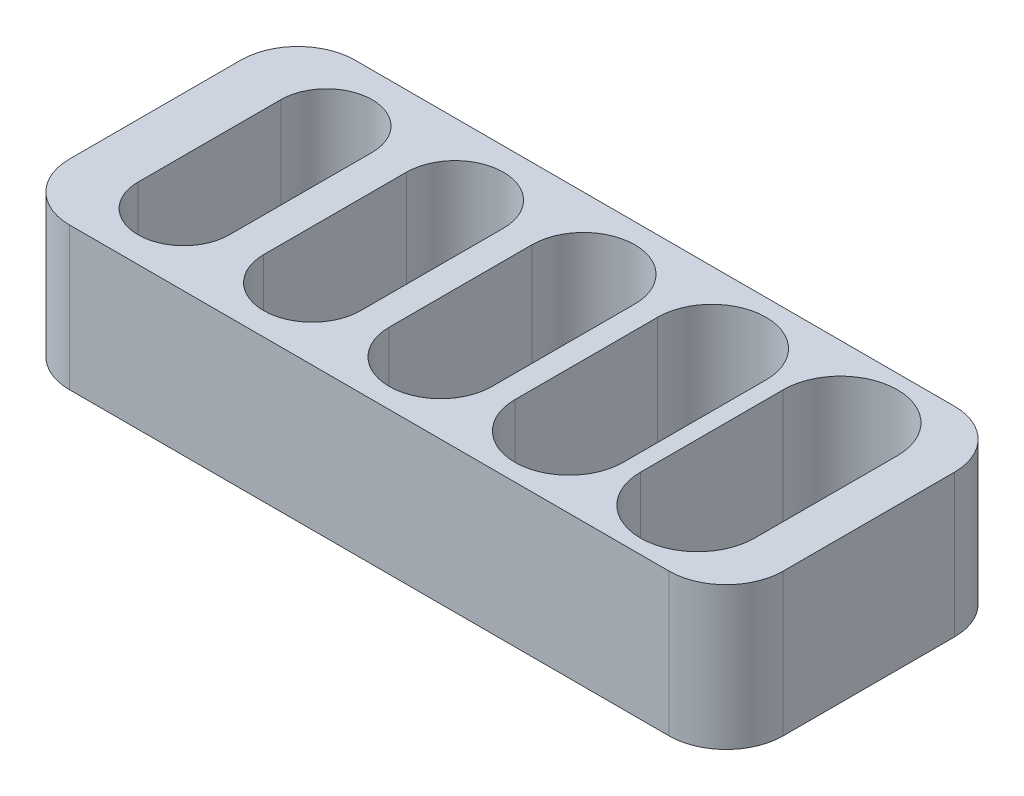
ISO-10303-21;
HEADER;
FILE_DESCRIPTION(('STEP AP214'),'2;1');
FILE_NAME('part.step','',(''),(''),'','','');
FILE_SCHEMA(('AUTOMOTIVE_DESIGN { 1 0 10303 214 1 1 1 1 }'));
ENDSEC;
DATA;
#1=APPLICATION_CONTEXT('core data for automotive mechanical design processes');
#2=APPLICATION_PROTOCOL_DEFINITION('international standard','automotive_design',2000,#1);
#3=PRODUCT_CONTEXT('',#1,'mechanical');
#4=PRODUCT('Part','Part','',(#3));
#5=PRODUCT_RELATED_PRODUCT_CATEGORY('part','',(#4));
#6=PRODUCT_DEFINITION_FORMATION('','',#4);
#7=PRODUCT_DEFINITION_CONTEXT('part definition',#1,'design');
#8=PRODUCT_DEFINITION('design','',#6,#7);
#9=PRODUCT_DEFINITION_SHAPE('','',#8);
#10=(LENGTH_UNIT() NAMED_UNIT(*) SI_UNIT(.MILLI.,.METRE.));
#11=(NAMED_UNIT(*) PLANE_ANGLE_UNIT() SI_UNIT($,.RADIAN.));
#12=(NAMED_UNIT(*) SI_UNIT($,.STERADIAN.) SOLID_ANGLE_UNIT());
#13=UNCERTAINTY_MEASURE_WITH_UNIT(LENGTH_MEASURE(1.E-05),#10,'distance_accuracy_value','');
#14=(GEOMETRIC_REPRESENTATION_CONTEXT(3) GLOBAL_UNCERTAINTY_ASSIGNED_CONTEXT((#13)) GLOBAL_UNIT_ASSIGNED_CONTEXT((#10,
#11,#12)) REPRESENTATION_CONTEXT('',''));
#15=CARTESIAN_POINT('',(0.,0.,0.));
#16=DIRECTION('',(0.,0.,1.));
#17=DIRECTION('',(1.,0.,0.));
#18=AXIS2_PLACEMENT_3D('',#15,#16,#17);
#19=CARTESIAN_POINT('',(0.,5.,0.));
#20=DIRECTION('',(0.,1.,0.));
#21=DIRECTION('',(0.,0.,1.));
#22=AXIS2_PLACEMENT_3D('',#19,#20,#21);
#23=PLANE('',#22);
#24=DIRECTION('',(0.,0.,-1.));
#25=VECTOR('',#24,1.);
#26=CARTESIAN_POINT('',(12.5,5.,5.));
#27=LINE('',#26,#25);
#28=CARTESIAN_POINT('',(12.5,5.,3.));
#29=VERTEX_POINT('',#28);
#30=CARTESIAN_POINT('',(12.5,5.,-3.));
#31=VERTEX_POINT('',#30);
#32=EDGE_CURVE('E465',#29,#31,#27,.T.);
#33=ORIENTED_EDGE('',*,*,#32,.T.);
#34=CARTESIAN_POINT('',(10.5,5.,-3.));
#35=DIRECTION('',(0.,1.,0.));
#36=DIRECTION('',(0.,0.,1.));
#37=AXIS2_PLACEMENT_3D('',#34,#35,#36);
#38=CIRCLE('',#37,2.);
#39=CARTESIAN_POINT('',(10.5,5.,-5.));
#40=VERTEX_POINT('',#39);
#41=EDGE_CURVE('E520',#31,#40,#38,.T.);
#42=ORIENTED_EDGE('',*,*,#41,.T.);
#43=DIRECTION('',(-1.,0.,0.));
#44=VECTOR('',#43,1.);
#45=CARTESIAN_POINT('',(12.5,5.,-5.));
#46=LINE('',#45,#44);
#47=CARTESIAN_POINT('',(-10.5,5.,-5.));
#48=VERTEX_POINT('',#47);
#49=EDGE_CURVE('E469',#40,#48,#46,.T.);
#50=ORIENTED_EDGE('',*,*,#49,.T.);
#51=CARTESIAN_POINT('',(-10.5,5.,-3.));
#52=DIRECTION('',(0.,1.,0.));
#53=DIRECTION('',(0.,0.,1.));
#54=AXIS2_PLACEMENT_3D('',#51,#52,#53);
#55=CIRCLE('',#54,2.);
#56=CARTESIAN_POINT('',(-12.5,5.,-3.));
#57=VERTEX_POINT('',#56);
#58=EDGE_CURVE('E512',#48,#57,#55,.T.);
#59=ORIENTED_EDGE('',*,*,#58,.T.);
#60=DIRECTION('',(0.,0.,1.));
#61=VECTOR('',#60,1.);
#62=CARTESIAN_POINT('',(-12.5,5.,5.));
#63=LINE('',#62,#61);
#64=CARTESIAN_POINT('',(-12.5,5.,3.));
#65=VERTEX_POINT('',#64);
#66=EDGE_CURVE('E458',#57,#65,#63,.T.);
#67=ORIENTED_EDGE('',*,*,#66,.T.);
#68=CARTESIAN_POINT('',(-10.5,5.,3.));
#69=DIRECTION('',(0.,1.,0.));
#70=DIRECTION('',(0.,0.,1.));
#71=AXIS2_PLACEMENT_3D('',#68,#69,#70);
#72=CIRCLE('',#71,2.);
#73=CARTESIAN_POINT('',(-10.5,5.,5.));
#74=VERTEX_POINT('',#73);
#75=EDGE_CURVE('E68',#65,#74,#72,.T.);
#76=ORIENTED_EDGE('',*,*,#75,.T.);
#77=DIRECTION('',(1.,0.,0.));
#78=VECTOR('',#77,1.);
#79=CARTESIAN_POINT('',(12.5,5.,5.));
#80=LINE('',#79,#78);
#81=CARTESIAN_POINT('',(10.5,5.,5.));
#82=VERTEX_POINT('',#81);
#83=EDGE_CURVE('E461',#74,#82,#80,.T.);
#84=ORIENTED_EDGE('',*,*,#83,.T.);
#85=CARTESIAN_POINT('',(10.5,5.,3.));
#86=DIRECTION('',(0.,1.,0.));
#87=DIRECTION('',(0.,0.,1.));
#88=AXIS2_PLACEMENT_3D('',#85,#86,#87);
#89=CIRCLE('',#88,2.);
#90=EDGE_CURVE('E517',#82,#29,#89,.T.);
#91=ORIENTED_EDGE('',*,*,#90,.T.);
#92=EDGE_LOOP('',(#33,#42,#50,#59,#67,#76,#84,#91));
#93=FACE_BOUND('',#92,.T.);
#94=DIRECTION('',(0.,0.,-1.));
#95=VECTOR('',#94,1.);
#96=CARTESIAN_POINT('',(1.8,5.,2.5));
#97=LINE('',#96,#95);
#98=CARTESIAN_POINT('',(1.8,5.,2.5));
#99=VERTEX_POINT('',#98);
#100=CARTESIAN_POINT('',(1.8,5.,-2.5));
#101=VERTEX_POINT('',#100);
#102=EDGE_CURVE('E418',#99,#101,#97,.T.);
#103=ORIENTED_EDGE('',*,*,#102,.F.);
#104=CARTESIAN_POINT('',(0.,5.,2.5));
#105=DIRECTION('',(0.,1.,0.));
#106=DIRECTION('',(0.,0.,1.));
#107=AXIS2_PLACEMENT_3D('',#104,#105,#106);
#108=CIRCLE('',#107,1.8);
#109=CARTESIAN_POINT('',(-1.8,5.,2.5));
#110=VERTEX_POINT('',#109);
#111=EDGE_CURVE('E415',#110,#99,#108,.T.);
#112=ORIENTED_EDGE('',*,*,#111,.F.);
#113=DIRECTION('',(0.,0.,1.));
#114=VECTOR('',#113,1.);
#115=CARTESIAN_POINT('',(-1.8,5.,2.5));
#116=LINE('',#115,#114);
#117=CARTESIAN_POINT('',(-1.8,5.,-2.5));
#118=VERTEX_POINT('',#117);
#119=EDGE_CURVE('E426',#118,#110,#116,.T.);
#120=ORIENTED_EDGE('',*,*,#119,.F.);
#121=CARTESIAN_POINT('',(0.,5.,-2.5));
#122=DIRECTION('',(0.,1.,0.));
#123=DIRECTION('',(0.,0.,1.));
#124=AXIS2_PLACEMENT_3D('',#121,#122,#123);
#125=CIRCLE('',#124,1.8);
#126=EDGE_CURVE('E422',#101,#118,#125,.T.);
#127=ORIENTED_EDGE('',*,*,#126,.F.);
#128=EDGE_LOOP('',(#103,#112,#120,#127));
#129=FACE_BOUND('',#128,.T.);
#130=DIRECTION('',(0.,0.,-1.));
#131=VECTOR('',#130,1.);
#132=CARTESIAN_POINT('',(-2.8,5.,2.5));
#133=LINE('',#132,#131);
#134=CARTESIAN_POINT('',(-2.8,5.,2.5));
#135=VERTEX_POINT('',#134);
#136=CARTESIAN_POINT('',(-2.8,5.,-2.5));
#137=VERTEX_POINT('',#136);
#138=EDGE_CURVE('E375',#135,#137,#133,.T.);
#139=ORIENTED_EDGE('',*,*,#138,.F.);
#140=CARTESIAN_POINT('',(-4.5,5.,2.5));
#141=DIRECTION('',(0.,1.,0.));
#142=DIRECTION('',(0.,0.,1.));
#143=AXIS2_PLACEMENT_3D('',#140,#141,#142);
#144=CIRCLE('',#143,1.7);
#145=CARTESIAN_POINT('',(-6.2,5.,2.5));
#146=VERTEX_POINT('',#145);
#147=EDGE_CURVE('E372',#146,#135,#144,.T.);
#148=ORIENTED_EDGE('',*,*,#147,.F.);
#149=DIRECTION('',(0.,0.,1.));
#150=VECTOR('',#149,1.);
#151=CARTESIAN_POINT('',(-6.2,5.,2.5));
#152=LINE('',#151,#150);
#153=CARTESIAN_POINT('',(-6.2,5.,-2.5));
#154=VERTEX_POINT('',#153);
#155=EDGE_CURVE('E383',#154,#146,#152,.T.);
#156=ORIENTED_EDGE('',*,*,#155,.F.);
#157=CARTESIAN_POINT('',(-4.5,5.,-2.5));
#158=DIRECTION('',(0.,1.,0.));
#159=DIRECTION('',(0.,0.,1.));
#160=AXIS2_PLACEMENT_3D('',#157,#158,#159);
#161=CIRCLE('',#160,1.7);
#162=EDGE_CURVE('E379',#137,#154,#161,.T.);
#163=ORIENTED_EDGE('',*,*,#162,.F.);
#164=EDGE_LOOP('',(#139,#148,#156,#163));
#165=FACE_BOUND('',#164,.T.);
#166=DIRECTION('',(0.,0.,-1.));
#167=VECTOR('',#166,1.);
#168=CARTESIAN_POINT('',(6.4,5.,2.5));
#169=LINE('',#168,#167);
#170=CARTESIAN_POINT('',(6.4,5.,2.5));
#171=VERTEX_POINT('',#170);
#172=CARTESIAN_POINT('',(6.4,5.,-2.5));
#173=VERTEX_POINT('',#172);
#174=EDGE_CURVE('E332',#171,#173,#169,.T.);
#175=ORIENTED_EDGE('',*,*,#174,.F.);
#176=CARTESIAN_POINT('',(4.5,5.,2.5));
#177=DIRECTION('',(0.,1.,0.));
#178=DIRECTION('',(0.,0.,1.));
#179=AXIS2_PLACEMENT_3D('',#176,#177,#178);
#180=CIRCLE('',#179,1.9);
#181=CARTESIAN_POINT('',(2.6,5.,2.5));
#182=VERTEX_POINT('',#181);
#183=EDGE_CURVE('E329',#182,#171,#180,.T.);
#184=ORIENTED_EDGE('',*,*,#183,.F.);
#185=DIRECTION('',(0.,0.,1.));
#186=VECTOR('',#185,1.);
#187=CARTESIAN_POINT('',(2.6,5.,2.5));
#188=LINE('',#187,#186);
#189=CARTESIAN_POINT('',(2.6,5.,-2.5));
#190=VERTEX_POINT('',#189);
#191=EDGE_CURVE('E340',#190,#182,#188,.T.);
#192=ORIENTED_EDGE('',*,*,#191,.F.);
#193=CARTESIAN_POINT('',(4.5,5.,-2.5));
#194=DIRECTION('',(0.,1.,0.));
#195=DIRECTION('',(0.,0.,1.));
#196=AXIS2_PLACEMENT_3D('',#193,#194,#195);
#197=CIRCLE('',#196,1.9);
#198=EDGE_CURVE('E336',#173,#190,#197,.T.);
#199=ORIENTED_EDGE('',*,*,#198,.F.);
#200=EDGE_LOOP('',(#175,#184,#192,#199));
#201=FACE_BOUND('',#200,.T.);
#202=DIRECTION('',(0.,0.,-1.));
#203=VECTOR('',#202,1.);
#204=CARTESIAN_POINT('',(-7.4,5.,2.5));
#205=LINE('',#204,#203);
#206=CARTESIAN_POINT('',(-7.4,5.,2.5));
#207=VERTEX_POINT('',#206);
#208=CARTESIAN_POINT('',(-7.4,5.,-2.5));
#209=VERTEX_POINT('',#208);
#210=EDGE_CURVE('E289',#207,#209,#205,.T.);
#211=ORIENTED_EDGE('',*,*,#210,.F.);
#212=CARTESIAN_POINT('',(-9.,5.,2.5));
#213=DIRECTION('',(0.,1.,0.));
#214=DIRECTION('',(0.,0.,1.));
#215=AXIS2_PLACEMENT_3D('',#212,#213,#214);
#216=CIRCLE('',#215,1.6);
#217=CARTESIAN_POINT('',(-10.6,5.,2.5));
#218=VERTEX_POINT('',#217);
#219=EDGE_CURVE('E286',#218,#207,#216,.T.);
#220=ORIENTED_EDGE('',*,*,#219,.F.);
#221=DIRECTION('',(0.,0.,1.));
#222=VECTOR('',#221,1.);
#223=CARTESIAN_POINT('',(-10.6,5.,2.5));
#224=LINE('',#223,#222);
#225=CARTESIAN_POINT('',(-10.6,5.,-2.5));
#226=VERTEX_POINT('',#225);
#227=EDGE_CURVE('E297',#226,#218,#224,.T.);
#228=ORIENTED_EDGE('',*,*,#227,.F.);
#229=CARTESIAN_POINT('',(-9.,5.,-2.5));
#230=DIRECTION('',(0.,1.,0.));
#231=DIRECTION('',(0.,0.,1.));
#232=AXIS2_PLACEMENT_3D('',#229,#230,#231);
#233=CIRCLE('',#232,1.6);
#234=EDGE_CURVE('E293',#209,#226,#233,.T.);
#235=ORIENTED_EDGE('',*,*,#234,.F.);
#236=EDGE_LOOP('',(#211,#220,#228,#235));
#237=FACE_BOUND('',#236,.T.);
#238=DIRECTION('',(0.,0.,-1.));
#239=VECTOR('',#238,1.);
#240=CARTESIAN_POINT('',(11.,5.,2.5));
#241=LINE('',#240,#239);
#242=CARTESIAN_POINT('',(11.,5.,2.5));
#243=VERTEX_POINT('',#242);
#244=CARTESIAN_POINT('',(11.,5.,-2.5));
#245=VERTEX_POINT('',#244);
#246=EDGE_CURVE('E244',#243,#245,#241,.T.);
#247=ORIENTED_EDGE('',*,*,#246,.F.);
#248=CARTESIAN_POINT('',(9.,5.,2.5));
#249=DIRECTION('',(0.,1.,0.));
#250=DIRECTION('',(0.,0.,1.));
#251=AXIS2_PLACEMENT_3D('',#248,#249,#250);
#252=CIRCLE('',#251,2.);
#253=CARTESIAN_POINT('',(7.,5.,2.5));
#254=VERTEX_POINT('',#253);
#255=EDGE_CURVE('E233',#254,#243,#252,.T.);
#256=ORIENTED_EDGE('',*,*,#255,.F.);
#257=DIRECTION('',(0.,0.,1.));
#258=VECTOR('',#257,1.);
#259=CARTESIAN_POINT('',(7.,5.,2.5));
#260=LINE('',#259,#258);
#261=CARTESIAN_POINT('',(7.,5.,-2.5));
#262=VERTEX_POINT('',#261);
#263=EDGE_CURVE('E262',#262,#254,#260,.T.);
#264=ORIENTED_EDGE('',*,*,#263,.F.);
#265=CARTESIAN_POINT('',(9.,5.,-2.5));
#266=DIRECTION('',(0.,1.,0.));
#267=DIRECTION('',(0.,0.,1.));
#268=AXIS2_PLACEMENT_3D('',#265,#266,#267);
#269=CIRCLE('',#268,2.);
#270=EDGE_CURVE('E258',#245,#262,#269,.T.);
#271=ORIENTED_EDGE('',*,*,#270,.F.);
#272=EDGE_LOOP('',(#247,#256,#264,#271));
#273=FACE_BOUND('',#272,.T.);
#274=ADVANCED_FACE('F45',(#93,#129,#165,#201,#237,#273),#23,.T.);
#275=CARTESIAN_POINT('',(0.,0.,0.));
#276=DIRECTION('',(0.,1.,0.));
#277=DIRECTION('',(0.,0.,1.));
#278=AXIS2_PLACEMENT_3D('',#275,#276,#277);
#279=PLANE('',#278);
#280=CARTESIAN_POINT('',(-9.,0.,2.5));
#281=DIRECTION('',(0.,1.,0.));
#282=DIRECTION('',(0.,0.,1.));
#283=AXIS2_PLACEMENT_3D('',#280,#281,#282);
#284=CIRCLE('',#283,1.6);
#285=CARTESIAN_POINT('',(-10.6,0.,2.5));
#286=VERTEX_POINT('',#285);
#287=CARTESIAN_POINT('',(-7.4,0.,2.5));
#288=VERTEX_POINT('',#287);
#289=EDGE_CURVE('E253',#286,#288,#284,.T.);
#290=ORIENTED_EDGE('',*,*,#289,.T.);
#291=DIRECTION('',(0.,0.,-1.));
#292=VECTOR('',#291,1.);
#293=CARTESIAN_POINT('',(-7.4,0.,2.5));
#294=LINE('',#293,#292);
#295=CARTESIAN_POINT('',(-7.4,0.,-2.5));
#296=VERTEX_POINT('',#295);
#297=EDGE_CURVE('E304',#288,#296,#294,.T.);
#298=ORIENTED_EDGE('',*,*,#297,.T.);
#299=CARTESIAN_POINT('',(-9.,0.,-2.5));
#300=DIRECTION('',(0.,1.,0.));
#301=DIRECTION('',(0.,0.,1.));
#302=AXIS2_PLACEMENT_3D('',#299,#300,#301);
#303=CIRCLE('',#302,1.6);
#304=CARTESIAN_POINT('',(-10.6,0.,-2.5));
#305=VERTEX_POINT('',#304);
#306=EDGE_CURVE('E308',#296,#305,#303,.T.);
#307=ORIENTED_EDGE('',*,*,#306,.T.);
#308=DIRECTION('',(0.,0.,1.));
#309=VECTOR('',#308,1.);
#310=CARTESIAN_POINT('',(-10.6,0.,2.5));
#311=LINE('',#310,#309);
#312=EDGE_CURVE('E290',#305,#286,#311,.T.);
#313=ORIENTED_EDGE('',*,*,#312,.T.);
#314=EDGE_LOOP('',(#290,#298,#307,#313));
#315=FACE_BOUND('',#314,.T.);
#316=CARTESIAN_POINT('',(-4.5,0.,2.5));
#317=DIRECTION('',(0.,1.,0.));
#318=DIRECTION('',(0.,0.,1.));
#319=AXIS2_PLACEMENT_3D('',#316,#317,#318);
#320=CIRCLE('',#319,1.7);
#321=CARTESIAN_POINT('',(-6.2,0.,2.5));
#322=VERTEX_POINT('',#321);
#323=CARTESIAN_POINT('',(-2.8,0.,2.5));
#324=VERTEX_POINT('',#323);
#325=EDGE_CURVE('E371',#322,#324,#320,.T.);
#326=ORIENTED_EDGE('',*,*,#325,.T.);
#327=DIRECTION('',(0.,0.,-1.));
#328=VECTOR('',#327,1.);
#329=CARTESIAN_POINT('',(-2.8,0.,2.5));
#330=LINE('',#329,#328);
#331=CARTESIAN_POINT('',(-2.8,0.,-2.5));
#332=VERTEX_POINT('',#331);
#333=EDGE_CURVE('E390',#324,#332,#330,.T.);
#334=ORIENTED_EDGE('',*,*,#333,.T.);
#335=CARTESIAN_POINT('',(-4.5,0.,-2.5));
#336=DIRECTION('',(0.,1.,0.));
#337=DIRECTION('',(0.,0.,1.));
#338=AXIS2_PLACEMENT_3D('',#335,#336,#337);
#339=CIRCLE('',#338,1.7);
#340=CARTESIAN_POINT('',(-6.2,0.,-2.5));
#341=VERTEX_POINT('',#340);
#342=EDGE_CURVE('E394',#332,#341,#339,.T.);
#343=ORIENTED_EDGE('',*,*,#342,.T.);
#344=DIRECTION('',(0.,0.,1.));
#345=VECTOR('',#344,1.);
#346=CARTESIAN_POINT('',(-6.2,0.,2.5));
#347=LINE('',#346,#345);
#348=EDGE_CURVE('E376',#341,#322,#347,.T.);
#349=ORIENTED_EDGE('',*,*,#348,.T.);
#350=EDGE_LOOP('',(#326,#334,#343,#349));
#351=FACE_BOUND('',#350,.T.);
#352=DIRECTION('',(-1.,0.,0.));
#353=VECTOR('',#352,1.);
#354=CARTESIAN_POINT('',(12.5,0.,-5.));
#355=LINE('',#354,#353);
#356=CARTESIAN_POINT('',(10.5,0.,-5.));
#357=VERTEX_POINT('',#356);
#358=CARTESIAN_POINT('',(-10.5,0.,-5.));
#359=VERTEX_POINT('',#358);
#360=EDGE_CURVE('E462',#357,#359,#355,.T.);
#361=ORIENTED_EDGE('',*,*,#360,.F.);
#362=CARTESIAN_POINT('',(10.5,0.,-3.));
#363=DIRECTION('',(0.,1.,0.));
#364=DIRECTION('',(0.,0.,1.));
#365=AXIS2_PLACEMENT_3D('',#362,#363,#364);
#366=CIRCLE('',#365,2.);
#367=CARTESIAN_POINT('',(12.5,0.,-3.));
#368=VERTEX_POINT('',#367);
#369=EDGE_CURVE('E502',#357,#368,#366,.F.);
#370=ORIENTED_EDGE('',*,*,#369,.T.);
#371=DIRECTION('',(0.,0.,-1.));
#372=VECTOR('',#371,1.);
#373=CARTESIAN_POINT('',(12.5,0.,5.));
#374=LINE('',#373,#372);
#375=CARTESIAN_POINT('',(12.5,0.,3.));
#376=VERTEX_POINT('',#375);
#377=EDGE_CURVE('E480',#376,#368,#374,.T.);
#378=ORIENTED_EDGE('',*,*,#377,.F.);
#379=CARTESIAN_POINT('',(10.5,0.,3.));
#380=DIRECTION('',(0.,1.,0.));
#381=DIRECTION('',(0.,0.,1.));
#382=AXIS2_PLACEMENT_3D('',#379,#380,#381);
#383=CIRCLE('',#382,2.);
#384=CARTESIAN_POINT('',(10.5,0.,5.));
#385=VERTEX_POINT('',#384);
#386=EDGE_CURVE('E499',#376,#385,#383,.F.);
#387=ORIENTED_EDGE('',*,*,#386,.T.);
#388=DIRECTION('',(1.,0.,0.));
#389=VECTOR('',#388,1.);
#390=CARTESIAN_POINT('',(12.5,0.,5.));
#391=LINE('',#390,#389);
#392=CARTESIAN_POINT('',(-10.5,0.,5.));
#393=VERTEX_POINT('',#392);
#394=EDGE_CURVE('E477',#393,#385,#391,.T.);
#395=ORIENTED_EDGE('',*,*,#394,.F.);
#396=CARTESIAN_POINT('',(-10.5,0.,3.));
#397=DIRECTION('',(0.,1.,0.));
#398=DIRECTION('',(0.,0.,1.));
#399=AXIS2_PLACEMENT_3D('',#396,#397,#398);
#400=CIRCLE('',#399,2.);
#401=CARTESIAN_POINT('',(-12.5,0.,3.));
#402=VERTEX_POINT('',#401);
#403=EDGE_CURVE('E496',#393,#402,#400,.F.);
#404=ORIENTED_EDGE('',*,*,#403,.T.);
#405=DIRECTION('',(0.,0.,1.));
#406=VECTOR('',#405,1.);
#407=CARTESIAN_POINT('',(-12.5,0.,5.));
#408=LINE('',#407,#406);
#409=CARTESIAN_POINT('',(-12.5,0.,-3.));
#410=VERTEX_POINT('',#409);
#411=EDGE_CURVE('E457',#410,#402,#408,.T.);
#412=ORIENTED_EDGE('',*,*,#411,.F.);
#413=CARTESIAN_POINT('',(-10.5,0.,-3.));
#414=DIRECTION('',(0.,1.,0.));
#415=DIRECTION('',(0.,0.,1.));
#416=AXIS2_PLACEMENT_3D('',#413,#414,#415);
#417=CIRCLE('',#416,2.);
#418=EDGE_CURVE('E493',#410,#359,#417,.F.);
#419=ORIENTED_EDGE('',*,*,#418,.T.);
#420=EDGE_LOOP('',(#361,#370,#378,#387,#395,#404,#412,#419));
#421=FACE_BOUND('',#420,.T.);
#422=CARTESIAN_POINT('',(0.,0.,2.5));
#423=DIRECTION('',(0.,1.,0.));
#424=DIRECTION('',(0.,0.,1.));
#425=AXIS2_PLACEMENT_3D('',#422,#423,#424);
#426=CIRCLE('',#425,1.8);
#427=CARTESIAN_POINT('',(-1.8,0.,2.5));
#428=VERTEX_POINT('',#427);
#429=CARTESIAN_POINT('',(1.8,0.,2.5));
#430=VERTEX_POINT('',#429);
#431=EDGE_CURVE('E414',#428,#430,#426,.T.);
#432=ORIENTED_EDGE('',*,*,#431,.T.);
#433=DIRECTION('',(0.,0.,-1.));
#434=VECTOR('',#433,1.);
#435=CARTESIAN_POINT('',(1.8,0.,2.5));
#436=LINE('',#435,#434);
#437=CARTESIAN_POINT('',(1.8,0.,-2.5));
#438=VERTEX_POINT('',#437);
#439=EDGE_CURVE('E433',#430,#438,#436,.T.);
#440=ORIENTED_EDGE('',*,*,#439,.T.);
#441=CARTESIAN_POINT('',(0.,0.,-2.5));
#442=DIRECTION('',(0.,1.,0.));
#443=DIRECTION('',(0.,0.,1.));
#444=AXIS2_PLACEMENT_3D('',#441,#442,#443);
#445=CIRCLE('',#444,1.8);
#446=CARTESIAN_POINT('',(-1.8,0.,-2.5));
#447=VERTEX_POINT('',#446);
#448=EDGE_CURVE('E437',#438,#447,#445,.T.);
#449=ORIENTED_EDGE('',*,*,#448,.T.);
#450=DIRECTION('',(0.,0.,1.));
#451=VECTOR('',#450,1.);
#452=CARTESIAN_POINT('',(-1.8,0.,2.5));
#453=LINE('',#452,#451);
#454=EDGE_CURVE('E419',#447,#428,#453,.T.);
#455=ORIENTED_EDGE('',*,*,#454,.T.);
#456=EDGE_LOOP('',(#432,#440,#449,#455));
#457=FACE_BOUND('',#456,.T.);
#458=CARTESIAN_POINT('',(4.5,0.,2.5));
#459=DIRECTION('',(0.,1.,0.));
#460=DIRECTION('',(0.,0.,1.));
#461=AXIS2_PLACEMENT_3D('',#458,#459,#460);
#462=CIRCLE('',#461,1.9);
#463=CARTESIAN_POINT('',(2.6,0.,2.5));
#464=VERTEX_POINT('',#463);
#465=CARTESIAN_POINT('',(6.4,0.,2.5));
#466=VERTEX_POINT('',#465);
#467=EDGE_CURVE('E328',#464,#466,#462,.T.);
#468=ORIENTED_EDGE('',*,*,#467,.T.);
#469=DIRECTION('',(0.,0.,-1.));
#470=VECTOR('',#469,1.);
#471=CARTESIAN_POINT('',(6.4,0.,2.5));
#472=LINE('',#471,#470);
#473=CARTESIAN_POINT('',(6.4,0.,-2.5));
#474=VERTEX_POINT('',#473);
#475=EDGE_CURVE('E347',#466,#474,#472,.T.);
#476=ORIENTED_EDGE('',*,*,#475,.T.);
#477=CARTESIAN_POINT('',(4.5,0.,-2.5));
#478=DIRECTION('',(0.,1.,0.));
#479=DIRECTION('',(0.,0.,1.));
#480=AXIS2_PLACEMENT_3D('',#477,#478,#479);
#481=CIRCLE('',#480,1.9);
#482=CARTESIAN_POINT('',(2.6,0.,-2.5));
#483=VERTEX_POINT('',#482);
#484=EDGE_CURVE('E351',#474,#483,#481,.T.);
#485=ORIENTED_EDGE('',*,*,#484,.T.);
#486=DIRECTION('',(0.,0.,1.));
#487=VECTOR('',#486,1.);
#488=CARTESIAN_POINT('',(2.6,0.,2.5));
#489=LINE('',#488,#487);
#490=EDGE_CURVE('E333',#483,#464,#489,.T.);
#491=ORIENTED_EDGE('',*,*,#490,.T.);
#492=EDGE_LOOP('',(#468,#476,#485,#491));
#493=FACE_BOUND('',#492,.T.);
#494=CARTESIAN_POINT('',(9.,0.,2.5));
#495=DIRECTION('',(0.,1.,0.));
#496=DIRECTION('',(0.,0.,1.));
#497=AXIS2_PLACEMENT_3D('',#494,#495,#496);
#498=CIRCLE('',#497,2.);
#499=CARTESIAN_POINT('',(7.,0.,2.5));
#500=VERTEX_POINT('',#499);
#501=CARTESIAN_POINT('',(11.,0.,2.5));
#502=VERTEX_POINT('',#501);
#503=EDGE_CURVE('E267',#500,#502,#498,.T.);
#504=ORIENTED_EDGE('',*,*,#503,.T.);
#505=DIRECTION('',(0.,0.,-1.));
#506=VECTOR('',#505,1.);
#507=CARTESIAN_POINT('',(11.,0.,2.5));
#508=LINE('',#507,#506);
#509=CARTESIAN_POINT('',(11.,0.,-2.5));
#510=VERTEX_POINT('',#509);
#511=EDGE_CURVE('E251',#502,#510,#508,.T.);
#512=ORIENTED_EDGE('',*,*,#511,.T.);
#513=CARTESIAN_POINT('',(9.,0.,-2.5));
#514=DIRECTION('',(0.,1.,0.));
#515=DIRECTION('',(0.,0.,1.));
#516=AXIS2_PLACEMENT_3D('',#513,#514,#515);
#517=CIRCLE('',#516,2.);
#518=CARTESIAN_POINT('',(7.,0.,-2.5));
#519=VERTEX_POINT('',#518);
#520=EDGE_CURVE('E272',#510,#519,#517,.T.);
#521=ORIENTED_EDGE('',*,*,#520,.T.);
#522=DIRECTION('',(0.,0.,1.));
#523=VECTOR('',#522,1.);
#524=CARTESIAN_POINT('',(7.,0.,2.5));
#525=LINE('',#524,#523);
#526=EDGE_CURVE('E245',#519,#500,#525,.T.);
#527=ORIENTED_EDGE('',*,*,#526,.T.);
#528=EDGE_LOOP('',(#504,#512,#521,#527));
#529=FACE_BOUND('',#528,.T.);
#530=ADVANCED_FACE('F540',(#315,#351,#421,#457,#493,#529),#279,.F.);
#531=CARTESIAN_POINT('',(-12.5,5.,5.));
#532=DIRECTION('',(1.,0.,0.));
#533=DIRECTION('',(0.,0.,-1.));
#534=AXIS2_PLACEMENT_3D('',#531,#532,#533);
#535=PLANE('',#534);
#536=ORIENTED_EDGE('',*,*,#411,.T.);
#537=DIRECTION('',(0.,-1.,0.));
#538=VECTOR('',#537,1.);
#539=CARTESIAN_POINT('',(-12.5,5.,3.));
#540=LINE('',#539,#538);
#541=EDGE_CURVE('E11',#402,#65,#540,.F.);
#542=ORIENTED_EDGE('',*,*,#541,.T.);
#543=ORIENTED_EDGE('',*,*,#66,.F.);
#544=DIRECTION('',(0.,-1.,0.));
#545=VECTOR('',#544,1.);
#546=CARTESIAN_POINT('',(-12.5,5.,-3.));
#547=LINE('',#546,#545);
#548=EDGE_CURVE('E54',#57,#410,#547,.T.);
#549=ORIENTED_EDGE('',*,*,#548,.T.);
#550=EDGE_LOOP('',(#536,#542,#543,#549));
#551=FACE_BOUND('',#550,.T.);
#552=ADVANCED_FACE('F534',(#551),#535,.F.);
#553=CARTESIAN_POINT('',(12.5,5.,5.));
#554=DIRECTION('',(0.,0.,-1.));
#555=DIRECTION('',(-1.,0.,0.));
#556=AXIS2_PLACEMENT_3D('',#553,#554,#555);
#557=PLANE('',#556);
#558=ORIENTED_EDGE('',*,*,#394,.T.);
#559=DIRECTION('',(0.,-1.,0.));
#560=VECTOR('',#559,1.);
#561=CARTESIAN_POINT('',(10.5,5.,5.));
#562=LINE('',#561,#560);
#563=EDGE_CURVE('E61',#385,#82,#562,.F.);
#564=ORIENTED_EDGE('',*,*,#563,.T.);
#565=ORIENTED_EDGE('',*,*,#83,.F.);
#566=DIRECTION('',(0.,-1.,0.));
#567=VECTOR('',#566,1.);
#568=CARTESIAN_POINT('',(-10.5,5.,5.));
#569=LINE('',#568,#567);
#570=EDGE_CURVE('E523',#74,#393,#569,.T.);
#571=ORIENTED_EDGE('',*,*,#570,.T.);
#572=EDGE_LOOP('',(#558,#564,#565,#571));
#573=FACE_BOUND('',#572,.T.);
#574=ADVANCED_FACE('F546',(#573),#557,.F.);
#575=CARTESIAN_POINT('',(12.5,5.,5.));
#576=DIRECTION('',(-1.,0.,0.));
#577=DIRECTION('',(0.,0.,1.));
#578=AXIS2_PLACEMENT_3D('',#575,#576,#577);
#579=PLANE('',#578);
#580=ORIENTED_EDGE('',*,*,#377,.T.);
#581=DIRECTION('',(0.,-1.,0.));
#582=VECTOR('',#581,1.);
#583=CARTESIAN_POINT('',(12.5,5.,-3.));
#584=LINE('',#583,#582);
#585=EDGE_CURVE('E509',#368,#31,#584,.F.);
#586=ORIENTED_EDGE('',*,*,#585,.T.);
#587=ORIENTED_EDGE('',*,*,#32,.F.);
#588=DIRECTION('',(0.,-1.,0.));
#589=VECTOR('',#588,1.);
#590=CARTESIAN_POINT('',(12.5,5.,3.));
#591=LINE('',#590,#589);
#592=EDGE_CURVE('E505',#29,#376,#591,.T.);
#593=ORIENTED_EDGE('',*,*,#592,.T.);
#594=EDGE_LOOP('',(#580,#586,#587,#593));
#595=FACE_BOUND('',#594,.T.);
#596=ADVANCED_FACE('F555',(#595),#579,.F.);
#597=CARTESIAN_POINT('',(12.5,5.,-5.));
#598=DIRECTION('',(0.,0.,1.));
#599=DIRECTION('',(1.,0.,0.));
#600=AXIS2_PLACEMENT_3D('',#597,#598,#599);
#601=PLANE('',#600);
#602=ORIENTED_EDGE('',*,*,#49,.F.);
#603=DIRECTION('',(0.,-1.,0.));
#604=VECTOR('',#603,1.);
#605=CARTESIAN_POINT('',(10.5,5.,-5.));
#606=LINE('',#605,#604);
#607=EDGE_CURVE('E489',#40,#357,#606,.T.);
#608=ORIENTED_EDGE('',*,*,#607,.T.);
#609=ORIENTED_EDGE('',*,*,#360,.T.);
#610=DIRECTION('',(0.,-1.,0.));
#611=VECTOR('',#610,1.);
#612=CARTESIAN_POINT('',(-10.5,5.,-5.));
#613=LINE('',#612,#611);
#614=EDGE_CURVE('E473',#359,#48,#613,.F.);
#615=ORIENTED_EDGE('',*,*,#614,.T.);
#616=EDGE_LOOP('',(#602,#608,#609,#615));
#617=FACE_BOUND('',#616,.T.);
#618=ADVANCED_FACE('F563',(#617),#601,.F.);
#619=CARTESIAN_POINT('',(0.,5.,2.5));
#620=DIRECTION('',(0.,-1.,0.));
#621=DIRECTION('',(0.,0.,-1.));
#622=AXIS2_PLACEMENT_3D('',#619,#620,#621);
#623=CYLINDRICAL_SURFACE('',#622,1.8);
#624=ORIENTED_EDGE('',*,*,#431,.F.);
#625=DIRECTION('',(0.,-1.,0.));
#626=VECTOR('',#625,1.);
#627=CARTESIAN_POINT('',(-1.8,5.,2.5));
#628=LINE('',#627,#626);
#629=EDGE_CURVE('E429',#110,#428,#628,.T.);
#630=ORIENTED_EDGE('',*,*,#629,.F.);
#631=ORIENTED_EDGE('',*,*,#111,.T.);
#632=DIRECTION('',(0.,-1.,0.));
#633=VECTOR('',#632,1.);
#634=CARTESIAN_POINT('',(1.8,5.,2.5));
#635=LINE('',#634,#633);
#636=EDGE_CURVE('E453',#99,#430,#635,.T.);
#637=ORIENTED_EDGE('',*,*,#636,.T.);
#638=EDGE_LOOP('',(#624,#630,#631,#637));
#639=FACE_BOUND('',#638,.T.);
#640=ADVANCED_FACE('F578',(#639),#623,.F.);
#641=CARTESIAN_POINT('',(1.8,5.,2.5));
#642=DIRECTION('',(-1.,0.,0.));
#643=DIRECTION('',(0.,0.,1.));
#644=AXIS2_PLACEMENT_3D('',#641,#642,#643);
#645=PLANE('',#644);
#646=ORIENTED_EDGE('',*,*,#439,.F.);
#647=ORIENTED_EDGE('',*,*,#636,.F.);
#648=ORIENTED_EDGE('',*,*,#102,.T.);
#649=DIRECTION('',(0.,-1.,0.));
#650=VECTOR('',#649,1.);
#651=CARTESIAN_POINT('',(1.8,5.,-2.5));
#652=LINE('',#651,#650);
#653=EDGE_CURVE('E450',#101,#438,#652,.T.);
#654=ORIENTED_EDGE('',*,*,#653,.T.);
#655=EDGE_LOOP('',(#646,#647,#648,#654));
#656=FACE_BOUND('',#655,.T.);
#657=ADVANCED_FACE('F768',(#656),#645,.T.);
#658=CARTESIAN_POINT('',(0.,5.,-2.5));
#659=DIRECTION('',(0.,-1.,0.));
#660=DIRECTION('',(0.,0.,-1.));
#661=AXIS2_PLACEMENT_3D('',#658,#659,#660);
#662=CYLINDRICAL_SURFACE('',#661,1.8);
#663=ORIENTED_EDGE('',*,*,#448,.F.);
#664=ORIENTED_EDGE('',*,*,#653,.F.);
#665=ORIENTED_EDGE('',*,*,#126,.T.);
#666=DIRECTION('',(0.,-1.,0.));
#667=VECTOR('',#666,1.);
#668=CARTESIAN_POINT('',(-1.8,5.,-2.5));
#669=LINE('',#668,#667);
#670=EDGE_CURVE('E447',#118,#447,#669,.T.);
#671=ORIENTED_EDGE('',*,*,#670,.T.);
#672=EDGE_LOOP('',(#663,#664,#665,#671));
#673=FACE_BOUND('',#672,.T.);
#674=ADVANCED_FACE('F759',(#673),#662,.F.);
#675=CARTESIAN_POINT('',(-1.8,5.,2.5));
#676=DIRECTION('',(1.,0.,0.));
#677=DIRECTION('',(0.,0.,-1.));
#678=AXIS2_PLACEMENT_3D('',#675,#676,#677);
#679=PLANE('',#678);
#680=ORIENTED_EDGE('',*,*,#454,.F.);
#681=ORIENTED_EDGE('',*,*,#670,.F.);
#682=ORIENTED_EDGE('',*,*,#119,.T.);
#683=ORIENTED_EDGE('',*,*,#629,.T.);
#684=EDGE_LOOP('',(#680,#681,#682,#683));
#685=FACE_BOUND('',#684,.T.);
#686=ADVANCED_FACE('F750',(#685),#679,.T.);
#687=CARTESIAN_POINT('',(-4.5,5.,2.5));
#688=DIRECTION('',(0.,-1.,0.));
#689=DIRECTION('',(0.,0.,-1.));
#690=AXIS2_PLACEMENT_3D('',#687,#688,#689);
#691=CYLINDRICAL_SURFACE('',#690,1.7);
#692=ORIENTED_EDGE('',*,*,#325,.F.);
#693=DIRECTION('',(0.,-1.,0.));
#694=VECTOR('',#693,1.);
#695=CARTESIAN_POINT('',(-6.2,5.,2.5));
#696=LINE('',#695,#694);
#697=EDGE_CURVE('E386',#146,#322,#696,.T.);
#698=ORIENTED_EDGE('',*,*,#697,.F.);
#699=ORIENTED_EDGE('',*,*,#147,.T.);
#700=DIRECTION('',(0.,-1.,0.));
#701=VECTOR('',#700,1.);
#702=CARTESIAN_POINT('',(-2.8,5.,2.5));
#703=LINE('',#702,#701);
#704=EDGE_CURVE('E410',#135,#324,#703,.T.);
#705=ORIENTED_EDGE('',*,*,#704,.T.);
#706=EDGE_LOOP('',(#692,#698,#699,#705));
#707=FACE_BOUND('',#706,.T.);
#708=ADVANCED_FACE('F741',(#707),#691,.F.);
#709=CARTESIAN_POINT('',(-2.8,5.,2.5));
#710=DIRECTION('',(-1.,0.,0.));
#711=DIRECTION('',(0.,0.,1.));
#712=AXIS2_PLACEMENT_3D('',#709,#710,#711);
#713=PLANE('',#712);
#714=ORIENTED_EDGE('',*,*,#333,.F.);
#715=ORIENTED_EDGE('',*,*,#704,.F.);
#716=ORIENTED_EDGE('',*,*,#138,.T.);
#717=DIRECTION('',(0.,-1.,0.));
#718=VECTOR('',#717,1.);
#719=CARTESIAN_POINT('',(-2.8,5.,-2.5));
#720=LINE('',#719,#718);
#721=EDGE_CURVE('E407',#137,#332,#720,.T.);
#722=ORIENTED_EDGE('',*,*,#721,.T.);
#723=EDGE_LOOP('',(#714,#715,#716,#722));
#724=FACE_BOUND('',#723,.T.);
#725=ADVANCED_FACE('F732',(#724),#713,.T.);
#726=CARTESIAN_POINT('',(-4.5,5.,-2.5));
#727=DIRECTION('',(0.,-1.,0.));
#728=DIRECTION('',(0.,0.,-1.));
#729=AXIS2_PLACEMENT_3D('',#726,#727,#728);
#730=CYLINDRICAL_SURFACE('',#729,1.7);
#731=ORIENTED_EDGE('',*,*,#342,.F.);
#732=ORIENTED_EDGE('',*,*,#721,.F.);
#733=ORIENTED_EDGE('',*,*,#162,.T.);
#734=DIRECTION('',(0.,-1.,0.));
#735=VECTOR('',#734,1.);
#736=CARTESIAN_POINT('',(-6.2,5.,-2.5));
#737=LINE('',#736,#735);
#738=EDGE_CURVE('E404',#154,#341,#737,.T.);
#739=ORIENTED_EDGE('',*,*,#738,.T.);
#740=EDGE_LOOP('',(#731,#732,#733,#739));
#741=FACE_BOUND('',#740,.T.);
#742=ADVANCED_FACE('F723',(#741),#730,.F.);
#743=CARTESIAN_POINT('',(-6.2,5.,2.5));
#744=DIRECTION('',(1.,0.,0.));
#745=DIRECTION('',(0.,0.,-1.));
#746=AXIS2_PLACEMENT_3D('',#743,#744,#745);
#747=PLANE('',#746);
#748=ORIENTED_EDGE('',*,*,#348,.F.);
#749=ORIENTED_EDGE('',*,*,#738,.F.);
#750=ORIENTED_EDGE('',*,*,#155,.T.);
#751=ORIENTED_EDGE('',*,*,#697,.T.);
#752=EDGE_LOOP('',(#748,#749,#750,#751));
#753=FACE_BOUND('',#752,.T.);
#754=ADVANCED_FACE('F714',(#753),#747,.T.);
#755=CARTESIAN_POINT('',(4.5,5.,2.5));
#756=DIRECTION('',(0.,-1.,0.));
#757=DIRECTION('',(0.,0.,-1.));
#758=AXIS2_PLACEMENT_3D('',#755,#756,#757);
#759=CYLINDRICAL_SURFACE('',#758,1.9);
#760=ORIENTED_EDGE('',*,*,#467,.F.);
#761=DIRECTION('',(0.,-1.,0.));
#762=VECTOR('',#761,1.);
#763=CARTESIAN_POINT('',(2.6,5.,2.5));
#764=LINE('',#763,#762);
#765=EDGE_CURVE('E343',#182,#464,#764,.T.);
#766=ORIENTED_EDGE('',*,*,#765,.F.);
#767=ORIENTED_EDGE('',*,*,#183,.T.);
#768=DIRECTION('',(0.,-1.,0.));
#769=VECTOR('',#768,1.);
#770=CARTESIAN_POINT('',(6.4,5.,2.5));
#771=LINE('',#770,#769);
#772=EDGE_CURVE('E367',#171,#466,#771,.T.);
#773=ORIENTED_EDGE('',*,*,#772,.T.);
#774=EDGE_LOOP('',(#760,#766,#767,#773));
#775=FACE_BOUND('',#774,.T.);
#776=ADVANCED_FACE('F705',(#775),#759,.F.);
#777=CARTESIAN_POINT('',(6.4,5.,2.5));
#778=DIRECTION('',(-1.,0.,0.));
#779=DIRECTION('',(0.,0.,1.));
#780=AXIS2_PLACEMENT_3D('',#777,#778,#779);
#781=PLANE('',#780);
#782=ORIENTED_EDGE('',*,*,#475,.F.);
#783=ORIENTED_EDGE('',*,*,#772,.F.);
#784=ORIENTED_EDGE('',*,*,#174,.T.);
#785=DIRECTION('',(0.,-1.,0.));
#786=VECTOR('',#785,1.);
#787=CARTESIAN_POINT('',(6.4,5.,-2.5));
#788=LINE('',#787,#786);
#789=EDGE_CURVE('E364',#173,#474,#788,.T.);
#790=ORIENTED_EDGE('',*,*,#789,.T.);
#791=EDGE_LOOP('',(#782,#783,#784,#790));
#792=FACE_BOUND('',#791,.T.);
#793=ADVANCED_FACE('F696',(#792),#781,.T.);
#794=CARTESIAN_POINT('',(4.5,5.,-2.5));
#795=DIRECTION('',(0.,-1.,0.));
#796=DIRECTION('',(0.,0.,-1.));
#797=AXIS2_PLACEMENT_3D('',#794,#795,#796);
#798=CYLINDRICAL_SURFACE('',#797,1.9);
#799=ORIENTED_EDGE('',*,*,#484,.F.);
#800=ORIENTED_EDGE('',*,*,#789,.F.);
#801=ORIENTED_EDGE('',*,*,#198,.T.);
#802=DIRECTION('',(0.,-1.,0.));
#803=VECTOR('',#802,1.);
#804=CARTESIAN_POINT('',(2.6,5.,-2.5));
#805=LINE('',#804,#803);
#806=EDGE_CURVE('E361',#190,#483,#805,.T.);
#807=ORIENTED_EDGE('',*,*,#806,.T.);
#808=EDGE_LOOP('',(#799,#800,#801,#807));
#809=FACE_BOUND('',#808,.T.);
#810=ADVANCED_FACE('F687',(#809),#798,.F.);
#811=CARTESIAN_POINT('',(2.6,5.,2.5));
#812=DIRECTION('',(1.,0.,0.));
#813=DIRECTION('',(0.,0.,-1.));
#814=AXIS2_PLACEMENT_3D('',#811,#812,#813);
#815=PLANE('',#814);
#816=ORIENTED_EDGE('',*,*,#490,.F.);
#817=ORIENTED_EDGE('',*,*,#806,.F.);
#818=ORIENTED_EDGE('',*,*,#191,.T.);
#819=ORIENTED_EDGE('',*,*,#765,.T.);
#820=EDGE_LOOP('',(#816,#817,#818,#819));
#821=FACE_BOUND('',#820,.T.);
#822=ADVANCED_FACE('F678',(#821),#815,.T.);
#823=CARTESIAN_POINT('',(-9.,5.,2.5));
#824=DIRECTION('',(0.,-1.,0.));
#825=DIRECTION('',(0.,0.,-1.));
#826=AXIS2_PLACEMENT_3D('',#823,#824,#825);
#827=CYLINDRICAL_SURFACE('',#826,1.6);
#828=ORIENTED_EDGE('',*,*,#289,.F.);
#829=DIRECTION('',(0.,-1.,0.));
#830=VECTOR('',#829,1.);
#831=CARTESIAN_POINT('',(-10.6,5.,2.5));
#832=LINE('',#831,#830);
#833=EDGE_CURVE('E300',#218,#286,#832,.T.);
#834=ORIENTED_EDGE('',*,*,#833,.F.);
#835=ORIENTED_EDGE('',*,*,#219,.T.);
#836=DIRECTION('',(0.,-1.,0.));
#837=VECTOR('',#836,1.);
#838=CARTESIAN_POINT('',(-7.4,5.,2.5));
#839=LINE('',#838,#837);
#840=EDGE_CURVE('E324',#207,#288,#839,.T.);
#841=ORIENTED_EDGE('',*,*,#840,.T.);
#842=EDGE_LOOP('',(#828,#834,#835,#841));
#843=FACE_BOUND('',#842,.T.);
#844=ADVANCED_FACE('F669',(#843),#827,.F.);
#845=CARTESIAN_POINT('',(-7.4,5.,2.5));
#846=DIRECTION('',(-1.,0.,0.));
#847=DIRECTION('',(0.,0.,1.));
#848=AXIS2_PLACEMENT_3D('',#845,#846,#847);
#849=PLANE('',#848);
#850=ORIENTED_EDGE('',*,*,#297,.F.);
#851=ORIENTED_EDGE('',*,*,#840,.F.);
#852=ORIENTED_EDGE('',*,*,#210,.T.);
#853=DIRECTION('',(0.,-1.,0.));
#854=VECTOR('',#853,1.);
#855=CARTESIAN_POINT('',(-7.4,5.,-2.5));
#856=LINE('',#855,#854);
#857=EDGE_CURVE('E321',#209,#296,#856,.T.);
#858=ORIENTED_EDGE('',*,*,#857,.T.);
#859=EDGE_LOOP('',(#850,#851,#852,#858));
#860=FACE_BOUND('',#859,.T.);
#861=ADVANCED_FACE('F660',(#860),#849,.T.);
#862=CARTESIAN_POINT('',(-9.,5.,-2.5));
#863=DIRECTION('',(0.,-1.,0.));
#864=DIRECTION('',(0.,0.,-1.));
#865=AXIS2_PLACEMENT_3D('',#862,#863,#864);
#866=CYLINDRICAL_SURFACE('',#865,1.6);
#867=ORIENTED_EDGE('',*,*,#306,.F.);
#868=ORIENTED_EDGE('',*,*,#857,.F.);
#869=ORIENTED_EDGE('',*,*,#234,.T.);
#870=DIRECTION('',(0.,-1.,0.));
#871=VECTOR('',#870,1.);
#872=CARTESIAN_POINT('',(-10.6,5.,-2.5));
#873=LINE('',#872,#871);
#874=EDGE_CURVE('E318',#226,#305,#873,.T.);
#875=ORIENTED_EDGE('',*,*,#874,.T.);
#876=EDGE_LOOP('',(#867,#868,#869,#875));
#877=FACE_BOUND('',#876,.T.);
#878=ADVANCED_FACE('F651',(#877),#866,.F.);
#879=CARTESIAN_POINT('',(-10.6,5.,2.5));
#880=DIRECTION('',(1.,0.,0.));
#881=DIRECTION('',(0.,0.,-1.));
#882=AXIS2_PLACEMENT_3D('',#879,#880,#881);
#883=PLANE('',#882);
#884=ORIENTED_EDGE('',*,*,#312,.F.);
#885=ORIENTED_EDGE('',*,*,#874,.F.);
#886=ORIENTED_EDGE('',*,*,#227,.T.);
#887=ORIENTED_EDGE('',*,*,#833,.T.);
#888=EDGE_LOOP('',(#884,#885,#886,#887));
#889=FACE_BOUND('',#888,.T.);
#890=ADVANCED_FACE('F643',(#889),#883,.T.);
#891=CARTESIAN_POINT('',(9.,5.,2.5));
#892=DIRECTION('',(0.,-1.,0.));
#893=DIRECTION('',(0.,0.,-1.));
#894=AXIS2_PLACEMENT_3D('',#891,#892,#893);
#895=CYLINDRICAL_SURFACE('',#894,2.);
#896=ORIENTED_EDGE('',*,*,#503,.F.);
#897=DIRECTION('',(0.,-1.,0.));
#898=VECTOR('',#897,1.);
#899=CARTESIAN_POINT('',(7.,5.,2.5));
#900=LINE('',#899,#898);
#901=EDGE_CURVE('E239',#254,#500,#900,.T.);
#902=ORIENTED_EDGE('',*,*,#901,.F.);
#903=ORIENTED_EDGE('',*,*,#255,.T.);
#904=DIRECTION('',(0.,-1.,0.));
#905=VECTOR('',#904,1.);
#906=CARTESIAN_POINT('',(11.,5.,2.5));
#907=LINE('',#906,#905);
#908=EDGE_CURVE('E236',#243,#502,#907,.T.);
#909=ORIENTED_EDGE('',*,*,#908,.T.);
#910=EDGE_LOOP('',(#896,#902,#903,#909));
#911=FACE_BOUND('',#910,.T.);
#912=ADVANCED_FACE('F235',(#911),#895,.F.);
#913=CARTESIAN_POINT('',(11.,5.,2.5));
#914=DIRECTION('',(-1.,0.,0.));
#915=DIRECTION('',(0.,0.,1.));
#916=AXIS2_PLACEMENT_3D('',#913,#914,#915);
#917=PLANE('',#916);
#918=ORIENTED_EDGE('',*,*,#511,.F.);
#919=ORIENTED_EDGE('',*,*,#908,.F.);
#920=ORIENTED_EDGE('',*,*,#246,.T.);
#921=DIRECTION('',(0.,-1.,0.));
#922=VECTOR('',#921,1.);
#923=CARTESIAN_POINT('',(11.,5.,-2.5));
#924=LINE('',#923,#922);
#925=EDGE_CURVE('E254',#245,#510,#924,.T.);
#926=ORIENTED_EDGE('',*,*,#925,.T.);
#927=EDGE_LOOP('',(#918,#919,#920,#926));
#928=FACE_BOUND('',#927,.T.);
#929=ADVANCED_FACE('F248',(#928),#917,.T.);
#930=CARTESIAN_POINT('',(9.,5.,-2.5));
#931=DIRECTION('',(0.,-1.,0.));
#932=DIRECTION('',(0.,0.,-1.));
#933=AXIS2_PLACEMENT_3D('',#930,#931,#932);
#934=CYLINDRICAL_SURFACE('',#933,2.);
#935=ORIENTED_EDGE('',*,*,#520,.F.);
#936=ORIENTED_EDGE('',*,*,#925,.F.);
#937=ORIENTED_EDGE('',*,*,#270,.T.);
#938=DIRECTION('',(0.,-1.,0.));
#939=VECTOR('',#938,1.);
#940=CARTESIAN_POINT('',(7.,5.,-2.5));
#941=LINE('',#940,#939);
#942=EDGE_CURVE('E281',#262,#519,#941,.T.);
#943=ORIENTED_EDGE('',*,*,#942,.T.);
#944=EDGE_LOOP('',(#935,#936,#937,#943));
#945=FACE_BOUND('',#944,.T.);
#946=ADVANCED_FACE('F619',(#945),#934,.F.);
#947=CARTESIAN_POINT('',(7.,5.,2.5));
#948=DIRECTION('',(1.,0.,0.));
#949=DIRECTION('',(0.,0.,-1.));
#950=AXIS2_PLACEMENT_3D('',#947,#948,#949);
#951=PLANE('',#950);
#952=ORIENTED_EDGE('',*,*,#526,.F.);
#953=ORIENTED_EDGE('',*,*,#942,.F.);
#954=ORIENTED_EDGE('',*,*,#263,.T.);
#955=ORIENTED_EDGE('',*,*,#901,.T.);
#956=EDGE_LOOP('',(#952,#953,#954,#955));
#957=FACE_BOUND('',#956,.T.);
#958=ADVANCED_FACE('F591',(#957),#951,.T.);
#959=CARTESIAN_POINT('',(10.5,5.,-3.));
#960=DIRECTION('',(0.,-1.,0.));
#961=DIRECTION('',(0.,0.,-1.));
#962=AXIS2_PLACEMENT_3D('',#959,#960,#961);
#963=CYLINDRICAL_SURFACE('',#962,2.);
#964=ORIENTED_EDGE('',*,*,#41,.F.);
#965=ORIENTED_EDGE('',*,*,#585,.F.);
#966=ORIENTED_EDGE('',*,*,#369,.F.);
#967=ORIENTED_EDGE('',*,*,#607,.F.);
#968=EDGE_LOOP('',(#964,#965,#966,#967));
#969=FACE_BOUND('',#968,.T.);
#970=ADVANCED_FACE('F560',(#969),#963,.T.);
#971=CARTESIAN_POINT('',(10.5,5.,3.));
#972=DIRECTION('',(0.,-1.,0.));
#973=DIRECTION('',(0.,0.,-1.));
#974=AXIS2_PLACEMENT_3D('',#971,#972,#973);
#975=CYLINDRICAL_SURFACE('',#974,2.);
#976=ORIENTED_EDGE('',*,*,#90,.F.);
#977=ORIENTED_EDGE('',*,*,#563,.F.);
#978=ORIENTED_EDGE('',*,*,#386,.F.);
#979=ORIENTED_EDGE('',*,*,#592,.F.);
#980=EDGE_LOOP('',(#976,#977,#978,#979));
#981=FACE_BOUND('',#980,.T.);
#982=ADVANCED_FACE('F552',(#981),#975,.T.);
#983=CARTESIAN_POINT('',(-10.5,5.,3.));
#984=DIRECTION('',(0.,-1.,0.));
#985=DIRECTION('',(0.,0.,-1.));
#986=AXIS2_PLACEMENT_3D('',#983,#984,#985);
#987=CYLINDRICAL_SURFACE('',#986,2.);
#988=ORIENTED_EDGE('',*,*,#75,.F.);
#989=ORIENTED_EDGE('',*,*,#541,.F.);
#990=ORIENTED_EDGE('',*,*,#403,.F.);
#991=ORIENTED_EDGE('',*,*,#570,.F.);
#992=EDGE_LOOP('',(#988,#989,#990,#991));
#993=FACE_BOUND('',#992,.T.);
#994=ADVANCED_FACE('F545',(#993),#987,.T.);
#995=CARTESIAN_POINT('',(-10.5,5.,-3.));
#996=DIRECTION('',(0.,-1.,0.));
#997=DIRECTION('',(0.,0.,-1.));
#998=AXIS2_PLACEMENT_3D('',#995,#996,#997);
#999=CYLINDRICAL_SURFACE('',#998,2.);
#1000=ORIENTED_EDGE('',*,*,#58,.F.);
#1001=ORIENTED_EDGE('',*,*,#614,.F.);
#1002=ORIENTED_EDGE('',*,*,#418,.F.);
#1003=ORIENTED_EDGE('',*,*,#548,.F.);
#1004=EDGE_LOOP('',(#1000,#1001,#1002,#1003));
#1005=FACE_BOUND('',#1004,.T.);
#1006=ADVANCED_FACE('F47',(#1005),#999,.T.);
#1007=CLOSED_SHELL('',(#274,#530,#552,#574,#596,#618,#640,#657,#674,#686,#708,#725,#742,#754,
#776,#793,#810,#822,#844,#861,#878,#890,#912,#929,#946,#958,#970,#982,#994,#1006));
#1008=MANIFOLD_SOLID_BREP('B2',#1007);
#1009=ADVANCED_BREP_SHAPE_REPRESENTATION('',(#18,#1008),#14);
#1010=SHAPE_DEFINITION_REPRESENTATION(#9,#1009);
ENDSEC;
END-ISO-10303-21;
